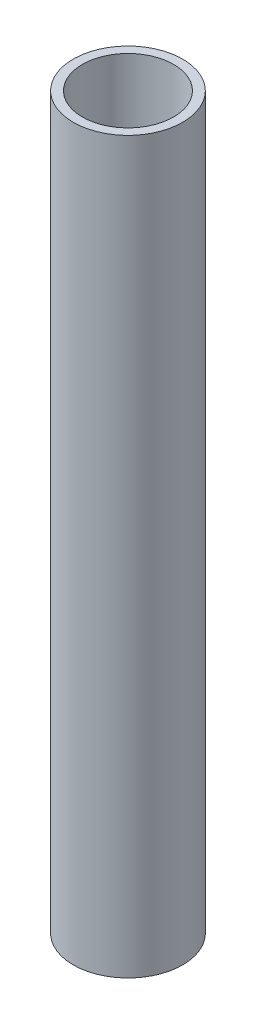
ISO-10303-21;
HEADER;
FILE_DESCRIPTION(('STEP AP214'),'2;1');
FILE_NAME('part.step','',(''),(''),'','','');
FILE_SCHEMA(('AUTOMOTIVE_DESIGN { 1 0 10303 214 1 1 1 1 }'));
ENDSEC;
DATA;
#1=APPLICATION_CONTEXT('core data for automotive mechanical design processes');
#2=APPLICATION_PROTOCOL_DEFINITION('international standard','automotive_design',2000,#1);
#3=PRODUCT_CONTEXT('',#1,'mechanical');
#4=PRODUCT('Part','Part','',(#3));
#5=PRODUCT_RELATED_PRODUCT_CATEGORY('part','',(#4));
#6=PRODUCT_DEFINITION_FORMATION('','',#4);
#7=PRODUCT_DEFINITION_CONTEXT('part definition',#1,'design');
#8=PRODUCT_DEFINITION('design','',#6,#7);
#9=PRODUCT_DEFINITION_SHAPE('','',#8);
#10=(LENGTH_UNIT() NAMED_UNIT(*) SI_UNIT(.MILLI.,.METRE.));
#11=(NAMED_UNIT(*) PLANE_ANGLE_UNIT() SI_UNIT($,.RADIAN.));
#12=(NAMED_UNIT(*) SI_UNIT($,.STERADIAN.) SOLID_ANGLE_UNIT());
#13=UNCERTAINTY_MEASURE_WITH_UNIT(LENGTH_MEASURE(1.E-05),#10,'distance_accuracy_value','');
#14=(GEOMETRIC_REPRESENTATION_CONTEXT(3) GLOBAL_UNCERTAINTY_ASSIGNED_CONTEXT((#13)) GLOBAL_UNIT_ASSIGNED_CONTEXT((#10,
#11,#12)) REPRESENTATION_CONTEXT('',''));
#15=CARTESIAN_POINT('',(0.,0.,0.));
#16=DIRECTION('',(0.,0.,1.));
#17=DIRECTION('',(1.,0.,0.));
#18=AXIS2_PLACEMENT_3D('',#15,#16,#17);
#19=CARTESIAN_POINT('',(0.,0.,0.));
#20=DIRECTION('',(0.,1.,0.));
#21=DIRECTION('',(0.,0.,1.));
#22=AXIS2_PLACEMENT_3D('',#19,#20,#21);
#23=PLANE('',#22);
#24=CARTESIAN_POINT('',(0.,0.,0.));
#25=DIRECTION('',(0.,1.,0.));
#26=DIRECTION('',(0.,0.,1.));
#27=AXIS2_PLACEMENT_3D('',#24,#25,#26);
#28=CIRCLE('',#27,15.);
#29=CARTESIAN_POINT('',(0.,0.,15.));
#30=VERTEX_POINT('',#29);
#31=EDGE_CURVE('E10',#30,#30,#28,.T.);
#32=ORIENTED_EDGE('',*,*,#31,.F.);
#33=EDGE_LOOP('',(#32));
#34=FACE_BOUND('',#33,.T.);
#35=ADVANCED_FACE('F37',(#34),#23,.F.);
#36=CARTESIAN_POINT('',(0.,200.,0.));
#37=DIRECTION('',(0.,1.,0.));
#38=DIRECTION('',(0.,0.,1.));
#39=AXIS2_PLACEMENT_3D('',#36,#37,#38);
#40=CYLINDRICAL_SURFACE('',#39,15.);
#41=CARTESIAN_POINT('',(0.,200.,0.));
#42=DIRECTION('',(0.,1.,0.));
#43=DIRECTION('',(0.,0.,1.));
#44=AXIS2_PLACEMENT_3D('',#41,#42,#43);
#45=CIRCLE('',#44,14.9999999999999);
#46=CARTESIAN_POINT('',(0.,200.,14.9999999999999));
#47=VERTEX_POINT('',#46);
#48=EDGE_CURVE('E43',#47,#47,#45,.T.);
#49=ORIENTED_EDGE('',*,*,#48,.F.);
#50=EDGE_LOOP('',(#49));
#51=FACE_BOUND('',#50,.T.);
#52=ORIENTED_EDGE('',*,*,#31,.T.);
#53=EDGE_LOOP('',(#52));
#54=FACE_BOUND('',#53,.T.);
#55=ADVANCED_FACE('F61',(#51,#54),#40,.T.);
#56=CARTESIAN_POINT('',(0.,200.,0.));
#57=DIRECTION('',(0.,-1.,0.));
#58=DIRECTION('',(0.,0.,-1.));
#59=AXIS2_PLACEMENT_3D('',#56,#57,#58);
#60=PLANE('',#59);
#61=CARTESIAN_POINT('',(0.,200.,0.));
#62=DIRECTION('',(0.,1.,0.));
#63=DIRECTION('',(0.,0.,1.));
#64=AXIS2_PLACEMENT_3D('',#61,#62,#63);
#65=CIRCLE('',#64,12.5);
#66=CARTESIAN_POINT('',(0.,200.,12.5));
#67=VERTEX_POINT('',#66);
#68=EDGE_CURVE('E51',#67,#67,#65,.T.);
#69=ORIENTED_EDGE('',*,*,#68,.F.);
#70=EDGE_LOOP('',(#69));
#71=FACE_BOUND('',#70,.T.);
#72=ORIENTED_EDGE('',*,*,#48,.T.);
#73=EDGE_LOOP('',(#72));
#74=FACE_BOUND('',#73,.T.);
#75=ADVANCED_FACE('F59',(#71,#74),#60,.F.);
#76=CARTESIAN_POINT('',(0.,20.,0.));
#77=DIRECTION('',(0.,1.,0.));
#78=DIRECTION('',(0.,0.,1.));
#79=AXIS2_PLACEMENT_3D('',#76,#77,#78);
#80=CYLINDRICAL_SURFACE('',#79,12.5);
#81=CARTESIAN_POINT('',(0.,20.,0.));
#82=DIRECTION('',(0.,1.,0.));
#83=DIRECTION('',(0.,0.,1.));
#84=AXIS2_PLACEMENT_3D('',#81,#82,#83);
#85=CIRCLE('',#84,12.5);
#86=CARTESIAN_POINT('',(0.,20.,12.5));
#87=VERTEX_POINT('',#86);
#88=EDGE_CURVE('E47',#87,#87,#85,.T.);
#89=CARTESIAN_POINT('',(0.,20.,12.5));
#90=CARTESIAN_POINT('',(0.,21.875,12.5));
#91=CARTESIAN_POINT('',(0.,23.75,12.5));
#92=CARTESIAN_POINT('',(0.,27.5,12.5));
#93=CARTESIAN_POINT('',(0.,29.375,12.5));
#94=CARTESIAN_POINT('',(0.,33.125,12.5));
#95=CARTESIAN_POINT('',(0.,35.,12.5));
#96=CARTESIAN_POINT('',(0.,38.75,12.5));
#97=CARTESIAN_POINT('',(0.,40.625,12.5));
#98=CARTESIAN_POINT('',(0.,44.375,12.5));
#99=CARTESIAN_POINT('',(0.,46.25,12.5));
#100=CARTESIAN_POINT('',(0.,50.,12.5));
#101=CARTESIAN_POINT('',(0.,51.875,12.5));
#102=CARTESIAN_POINT('',(0.,55.625,12.5));
#103=CARTESIAN_POINT('',(0.,57.5,12.5));
#104=CARTESIAN_POINT('',(0.,61.25,12.5));
#105=CARTESIAN_POINT('',(0.,63.125,12.5));
#106=CARTESIAN_POINT('',(0.,66.875,12.5));
#107=CARTESIAN_POINT('',(0.,68.75,12.5));
#108=CARTESIAN_POINT('',(0.,72.5,12.5));
#109=CARTESIAN_POINT('',(0.,74.375,12.5));
#110=CARTESIAN_POINT('',(0.,78.125,12.5));
#111=CARTESIAN_POINT('',(0.,80.,12.5));
#112=CARTESIAN_POINT('',(0.,83.75,12.5));
#113=CARTESIAN_POINT('',(0.,85.625,12.5));
#114=CARTESIAN_POINT('',(0.,89.375,12.5));
#115=CARTESIAN_POINT('',(0.,91.25,12.5));
#116=CARTESIAN_POINT('',(0.,95.,12.5));
#117=CARTESIAN_POINT('',(0.,96.875,12.5));
#118=CARTESIAN_POINT('',(0.,100.625,12.5));
#119=CARTESIAN_POINT('',(0.,102.5,12.5));
#120=CARTESIAN_POINT('',(0.,106.25,12.5));
#121=CARTESIAN_POINT('',(0.,108.125,12.5));
#122=CARTESIAN_POINT('',(0.,111.875,12.5));
#123=CARTESIAN_POINT('',(0.,113.75,12.5));
#124=CARTESIAN_POINT('',(0.,117.5,12.5));
#125=CARTESIAN_POINT('',(0.,119.375,12.5));
#126=CARTESIAN_POINT('',(0.,123.125,12.5));
#127=CARTESIAN_POINT('',(0.,125.,12.5));
#128=CARTESIAN_POINT('',(0.,128.75,12.5));
#129=CARTESIAN_POINT('',(0.,130.625,12.5));
#130=CARTESIAN_POINT('',(0.,134.375,12.5));
#131=CARTESIAN_POINT('',(0.,136.25,12.5));
#132=CARTESIAN_POINT('',(0.,140.,12.5));
#133=CARTESIAN_POINT('',(0.,141.875,12.5));
#134=CARTESIAN_POINT('',(0.,145.625,12.5));
#135=CARTESIAN_POINT('',(0.,147.5,12.5));
#136=CARTESIAN_POINT('',(0.,151.25,12.5));
#137=CARTESIAN_POINT('',(0.,153.125,12.5));
#138=CARTESIAN_POINT('',(0.,156.875,12.5));
#139=CARTESIAN_POINT('',(0.,158.75,12.5));
#140=CARTESIAN_POINT('',(0.,162.5,12.5));
#141=CARTESIAN_POINT('',(0.,164.375,12.5));
#142=CARTESIAN_POINT('',(0.,168.125,12.5));
#143=CARTESIAN_POINT('',(0.,170.,12.5));
#144=CARTESIAN_POINT('',(0.,173.75,12.5));
#145=CARTESIAN_POINT('',(0.,175.625,12.5));
#146=CARTESIAN_POINT('',(0.,179.375,12.5));
#147=CARTESIAN_POINT('',(0.,181.25,12.5));
#148=CARTESIAN_POINT('',(0.,185.,12.5));
#149=CARTESIAN_POINT('',(0.,186.875,12.5));
#150=CARTESIAN_POINT('',(0.,190.625,12.5));
#151=CARTESIAN_POINT('',(0.,192.5,12.5));
#152=CARTESIAN_POINT('',(0.,196.25,12.5));
#153=CARTESIAN_POINT('',(0.,198.125,12.5));
#154=CARTESIAN_POINT('',(0.,200.,12.5));
#155=B_SPLINE_CURVE_WITH_KNOTS('',3,(#89,#90,#91,#92,#93,#94,#95,#96,#97,#98,#99,#100,#101,#102,
#103,#104,#105,#106,#107,#108,#109,#110,#111,#112,#113,#114,#115,#116,#117,#118,#119,#120,#121,
#122,#123,#124,#125,#126,#127,#128,#129,#130,#131,#132,#133,#134,#135,#136,#137,#138,#139,#140,
#141,#142,#143,#144,#145,#146,#147,#148,#149,#150,#151,#152,#153,#154),.UNSPECIFIED.,.F.,.F.,(4,
2,2,2,2,2,2,2,2,2,2,2,2,2,2,2,2,2,2,2,2,2,2,2,2,2,2,2,2,2,2,2,4),(0.,5.625,11.25,16.875,22.5,
28.125,33.75,39.375,45.,50.625,56.25,61.875,67.5,73.125,78.75,84.375,90.,95.625,101.25,106.875,
112.5,118.125,123.75,129.375,135.,140.625,146.25,151.875,157.5,163.125,168.75,174.375,180.),.UNSPECIFIED.);
#156=EDGE_CURVE('BSEAM57',#87,#67,#155,.T.);
#157=ORIENTED_EDGE('',*,*,#88,.F.);
#158=ORIENTED_EDGE('',*,*,#68,.T.);
#159=ORIENTED_EDGE('',*,*,#156,.T.);
#160=ORIENTED_EDGE('',*,*,#156,.F.);
#161=EDGE_LOOP('',(#157,#159,#158,#160));
#162=FACE_BOUND('',#161,.T.);
#163=ADVANCED_FACE('F57',(#162),#80,.F.);
#164=CARTESIAN_POINT('',(0.,20.,0.));
#165=DIRECTION('',(0.,1.,0.));
#166=DIRECTION('',(0.,0.,1.));
#167=AXIS2_PLACEMENT_3D('',#164,#165,#166);
#168=PLANE('',#167);
#169=ORIENTED_EDGE('',*,*,#88,.T.);
#170=EDGE_LOOP('',(#169));
#171=FACE_BOUND('',#170,.T.);
#172=ADVANCED_FACE('F67',(#171),#168,.T.);
#173=CLOSED_SHELL('',(#35,#55,#75,#163,#172));
#174=MANIFOLD_SOLID_BREP('B2',#173);
#175=ADVANCED_BREP_SHAPE_REPRESENTATION('',(#18,#174),#14);
#176=SHAPE_DEFINITION_REPRESENTATION(#9,#175);
ENDSEC;
END-ISO-10303-21;
